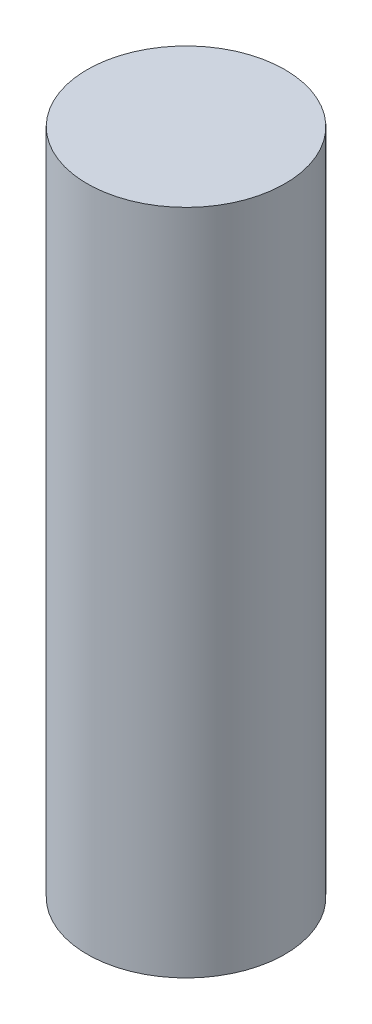
ISO-10303-21;
HEADER;
FILE_DESCRIPTION(('STEP AP214'),'2;1');
FILE_NAME('part.step','',(''),(''),'','','');
FILE_SCHEMA(('AUTOMOTIVE_DESIGN { 1 0 10303 214 1 1 1 1 }'));
ENDSEC;
DATA;
#1=APPLICATION_CONTEXT('core data for automotive mechanical design processes');
#2=APPLICATION_PROTOCOL_DEFINITION('international standard','automotive_design',2000,#1);
#3=PRODUCT_CONTEXT('',#1,'mechanical');
#4=PRODUCT('Part','Part','',(#3));
#5=PRODUCT_RELATED_PRODUCT_CATEGORY('part','',(#4));
#6=PRODUCT_DEFINITION_FORMATION('','',#4);
#7=PRODUCT_DEFINITION_CONTEXT('part definition',#1,'design');
#8=PRODUCT_DEFINITION('design','',#6,#7);
#9=PRODUCT_DEFINITION_SHAPE('','',#8);
#10=(LENGTH_UNIT() NAMED_UNIT(*) SI_UNIT(.MILLI.,.METRE.));
#11=(NAMED_UNIT(*) PLANE_ANGLE_UNIT() SI_UNIT($,.RADIAN.));
#12=(NAMED_UNIT(*) SI_UNIT($,.STERADIAN.) SOLID_ANGLE_UNIT());
#13=UNCERTAINTY_MEASURE_WITH_UNIT(LENGTH_MEASURE(1.E-05),#10,'distance_accuracy_value','');
#14=(GEOMETRIC_REPRESENTATION_CONTEXT(3) GLOBAL_UNCERTAINTY_ASSIGNED_CONTEXT((#13)) GLOBAL_UNIT_ASSIGNED_CONTEXT((#10,
#11,#12)) REPRESENTATION_CONTEXT('',''));
#15=CARTESIAN_POINT('',(0.,0.,0.));
#16=DIRECTION('',(0.,0.,1.));
#17=DIRECTION('',(1.,0.,0.));
#18=AXIS2_PLACEMENT_3D('',#15,#16,#17);
#19=CARTESIAN_POINT('',(0.,13500.,0.));
#20=DIRECTION('',(0.,1.,0.));
#21=DIRECTION('',(0.,0.,1.));
#22=AXIS2_PLACEMENT_3D('',#19,#20,#21);
#23=PLANE('',#22);
#24=CARTESIAN_POINT('',(0.,13500.,0.));
#25=DIRECTION('',(0.,-1.,0.));
#26=DIRECTION('',(0.,0.,-1.));
#27=AXIS2_PLACEMENT_3D('',#24,#25,#26);
#28=CIRCLE('',#27,2000.);
#29=CARTESIAN_POINT('',(0.,13500.,-2000.));
#30=VERTEX_POINT('',#29);
#31=EDGE_CURVE('E10',#30,#30,#28,.T.);
#32=ORIENTED_EDGE('',*,*,#31,.F.);
#33=EDGE_LOOP('',(#32));
#34=FACE_BOUND('',#33,.T.);
#35=ADVANCED_FACE('F40',(#34),#23,.T.);
#36=CARTESIAN_POINT('',(0.,-2658.35614211635,0.));
#37=DIRECTION('',(0.,-1.,0.));
#38=DIRECTION('',(0.,0.,-1.));
#39=AXIS2_PLACEMENT_3D('',#36,#37,#38);
#40=CYLINDRICAL_SURFACE('',#39,2000.);
#41=ORIENTED_EDGE('',*,*,#31,.T.);
#42=EDGE_LOOP('',(#41));
#43=FACE_BOUND('',#42,.T.);
#44=CARTESIAN_POINT('',(0.,0.,0.));
#45=DIRECTION('',(0.,-1.,0.));
#46=DIRECTION('',(0.,0.,-1.));
#47=AXIS2_PLACEMENT_3D('',#44,#45,#46);
#48=CIRCLE('',#47,2000.);
#49=CARTESIAN_POINT('',(0.,0.,-2000.));
#50=VERTEX_POINT('',#49);
#51=EDGE_CURVE('E43',#50,#50,#48,.T.);
#52=ORIENTED_EDGE('',*,*,#51,.F.);
#53=EDGE_LOOP('',(#52));
#54=FACE_BOUND('',#53,.T.);
#55=ADVANCED_FACE('F51',(#43,#54),#40,.T.);
#56=CARTESIAN_POINT('',(0.,0.,0.));
#57=DIRECTION('',(0.,-1.,0.));
#58=DIRECTION('',(0.,0.,-1.));
#59=AXIS2_PLACEMENT_3D('',#56,#57,#58);
#60=PLANE('',#59);
#61=ORIENTED_EDGE('',*,*,#51,.T.);
#62=EDGE_LOOP('',(#61));
#63=FACE_BOUND('',#62,.T.);
#64=ADVANCED_FACE('F47',(#63),#60,.T.);
#65=CLOSED_SHELL('',(#35,#55,#64));
#66=MANIFOLD_SOLID_BREP('B2',#65);
#67=ADVANCED_BREP_SHAPE_REPRESENTATION('',(#18,#66),#14);
#68=SHAPE_DEFINITION_REPRESENTATION(#9,#67);
ENDSEC;
END-ISO-10303-21;
